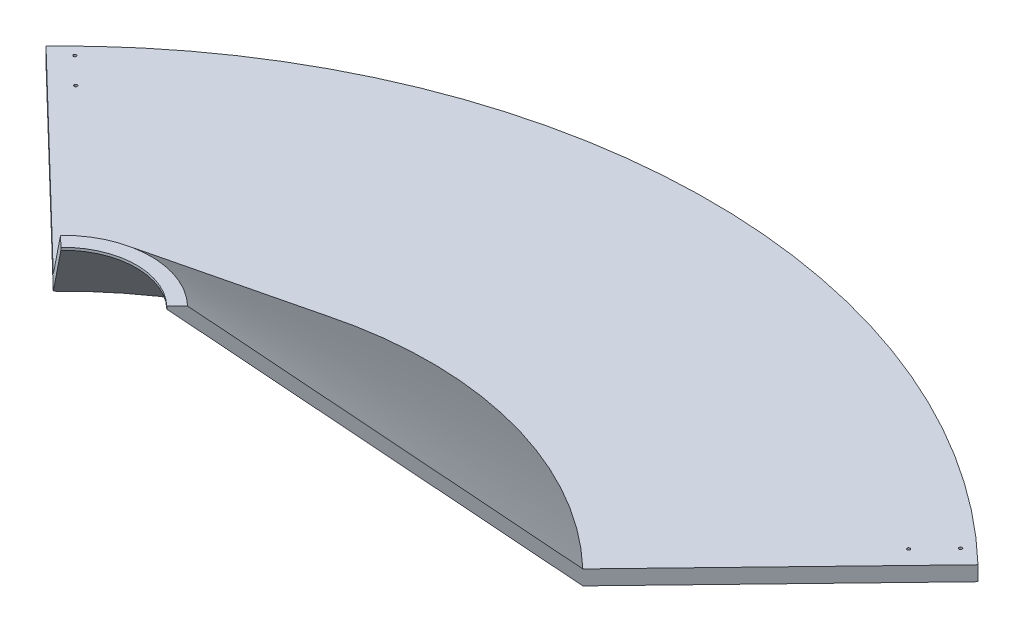
ISO-10303-21;
HEADER;
FILE_DESCRIPTION(('STEP AP214'),'2;1');
FILE_NAME('part.step','',(''),(''),'','','');
FILE_SCHEMA(('AUTOMOTIVE_DESIGN { 1 0 10303 214 1 1 1 1 }'));
ENDSEC;
DATA;
#1=APPLICATION_CONTEXT('core data for automotive mechanical design processes');
#2=APPLICATION_PROTOCOL_DEFINITION('international standard','automotive_design',2000,#1);
#3=PRODUCT_CONTEXT('',#1,'mechanical');
#4=PRODUCT('Part','Part','',(#3));
#5=PRODUCT_RELATED_PRODUCT_CATEGORY('part','',(#4));
#6=PRODUCT_DEFINITION_FORMATION('','',#4);
#7=PRODUCT_DEFINITION_CONTEXT('part definition',#1,'design');
#8=PRODUCT_DEFINITION('design','',#6,#7);
#9=PRODUCT_DEFINITION_SHAPE('','',#8);
#10=(LENGTH_UNIT() NAMED_UNIT(*) SI_UNIT(.MILLI.,.METRE.));
#11=(NAMED_UNIT(*) PLANE_ANGLE_UNIT() SI_UNIT($,.RADIAN.));
#12=(NAMED_UNIT(*) SI_UNIT($,.STERADIAN.) SOLID_ANGLE_UNIT());
#13=UNCERTAINTY_MEASURE_WITH_UNIT(LENGTH_MEASURE(1.E-05),#10,'distance_accuracy_value','');
#14=(GEOMETRIC_REPRESENTATION_CONTEXT(3) GLOBAL_UNCERTAINTY_ASSIGNED_CONTEXT((#13)) GLOBAL_UNIT_ASSIGNED_CONTEXT((#10,
#11,#12)) REPRESENTATION_CONTEXT('',''));
#15=CARTESIAN_POINT('',(0.,0.,0.));
#16=DIRECTION('',(0.,0.,1.));
#17=DIRECTION('',(1.,0.,0.));
#18=AXIS2_PLACEMENT_3D('',#15,#16,#17);
#19=CARTESIAN_POINT('',(457.650108708825,481.31508581917,0.));
#20=DIRECTION('',(0.,1.,0.));
#21=DIRECTION('',(-1.,0.,0.));
#22=AXIS2_PLACEMENT_3D('',#19,#20,#21);
#23=CYLINDRICAL_SURFACE('',#22,880.);
#24=CARTESIAN_POINT('',(457.650108708825,6.06253872324708,0.));
#25=DIRECTION('',(0.,1.,0.));
#26=DIRECTION('',(-1.,0.,0.));
#27=AXIS2_PLACEMENT_3D('',#24,#25,#26);
#28=CIRCLE('',#27,880.);
#29=CARTESIAN_POINT('',(1068.35624743679,6.06253872324719,-633.591360515577));
#30=VERTEX_POINT('',#29);
#31=CARTESIAN_POINT('',(-175.941251806752,6.06253872324697,-610.706138727965));
#32=VERTEX_POINT('',#31);
#33=EDGE_CURVE('E313',#30,#32,#28,.T.);
#34=ORIENTED_EDGE('',*,*,#33,.F.);
#35=DIRECTION('',(0.,1.,0.));
#36=VECTOR('',#35,1.);
#37=CARTESIAN_POINT('',(1068.35624743679,481.31508581917,-633.591360515577));
#38=LINE('',#37,#36);
#39=CARTESIAN_POINT('',(1068.35624743679,-13.9374612767531,-633.591360515577));
#40=VERTEX_POINT('',#39);
#41=EDGE_CURVE('E292',#30,#40,#38,.F.);
#42=ORIENTED_EDGE('',*,*,#41,.T.);
#43=CARTESIAN_POINT('',(457.650108708825,-13.9374612767529,0.));
#44=DIRECTION('',(0.,1.,0.));
#45=DIRECTION('',(-1.,0.,0.));
#46=AXIS2_PLACEMENT_3D('',#43,#44,#45);
#47=CIRCLE('',#46,880.);
#48=CARTESIAN_POINT('',(-175.941251806752,-13.937461276753,-610.706138727965));
#49=VERTEX_POINT('',#48);
#50=EDGE_CURVE('E295',#40,#49,#47,.T.);
#51=ORIENTED_EDGE('',*,*,#50,.T.);
#52=DIRECTION('',(0.,1.,0.));
#53=VECTOR('',#52,1.);
#54=CARTESIAN_POINT('',(-175.941251806752,481.315085819169,-610.706138727965));
#55=LINE('',#54,#53);
#56=EDGE_CURVE('E274',#49,#32,#55,.T.);
#57=ORIENTED_EDGE('',*,*,#56,.T.);
#58=EDGE_LOOP('',(#34,#42,#51,#57));
#59=FACE_BOUND('',#58,.T.);
#60=ADVANCED_FACE('F82',(#59),#23,.T.);
#61=CARTESIAN_POINT('',(-422.349891291175,6.0625387232469,0.));
#62=DIRECTION('',(0.,1.,0.));
#63=DIRECTION('',(-1.,0.,0.));
#64=AXIS2_PLACEMENT_3D('',#61,#62,#63);
#65=PLANE('',#64);
#66=CARTESIAN_POINT('',(1037.29315306664,6.06253872324715,-640.990486690408));
#67=DIRECTION('',(0.,1.,0.));
#68=DIRECTION('',(0.,0.,1.));
#69=AXIS2_PLACEMENT_3D('',#66,#67,#68);
#70=CIRCLE('',#69,2.09999999999999);
#71=CARTESIAN_POINT('',(1037.29315306664,6.06253872324715,-638.890486690408));
#72=VERTEX_POINT('',#71);
#73=EDGE_CURVE('E589',#72,#72,#70,.T.);
#74=ORIENTED_EDGE('',*,*,#73,.F.);
#75=EDGE_LOOP('',(#74));
#76=FACE_BOUND('',#75,.T.);
#77=CARTESIAN_POINT('',(1002.59394063891,6.06253872324714,-604.990977570205));
#78=DIRECTION('',(0.,1.,0.));
#79=DIRECTION('',(0.,0.,1.));
#80=AXIS2_PLACEMENT_3D('',#77,#78,#79);
#81=CIRCLE('',#80,2.09999999999999);
#82=CARTESIAN_POINT('',(1002.59394063891,6.06253872324714,-602.890977570205));
#83=VERTEX_POINT('',#82);
#84=EDGE_CURVE('E583',#83,#83,#81,.T.);
#85=ORIENTED_EDGE('',*,*,#84,.F.);
#86=EDGE_LOOP('',(#85));
#87=FACE_BOUND('',#86,.T.);
#88=CARTESIAN_POINT('',(-145.171244311085,6.06253872324695,-619.242504390037));
#89=DIRECTION('',(0.,1.,0.));
#90=DIRECTION('',(0.,0.,1.));
#91=AXIS2_PLACEMENT_3D('',#88,#89,#90);
#92=CIRCLE('',#91,2.09999999999999);
#93=CARTESIAN_POINT('',(-145.171244311085,6.06253872324695,-617.142504390037));
#94=VERTEX_POINT('',#93);
#95=EDGE_CURVE('E577',#94,#94,#92,.T.);
#96=ORIENTED_EDGE('',*,*,#95,.F.);
#97=EDGE_LOOP('',(#96));
#98=FACE_BOUND('',#97,.T.);
#99=CARTESIAN_POINT('',(-109.171735190882,6.06253872324695,-584.543291962312));
#100=DIRECTION('',(0.,1.,0.));
#101=DIRECTION('',(0.,0.,1.));
#102=AXIS2_PLACEMENT_3D('',#99,#100,#101);
#103=CIRCLE('',#102,2.09999999999999);
#104=CARTESIAN_POINT('',(-109.171735190882,6.06253872324695,-582.443291962312));
#105=VERTEX_POINT('',#104);
#106=EDGE_CURVE('E568',#105,#105,#103,.T.);
#107=ORIENTED_EDGE('',*,*,#106,.F.);
#108=EDGE_LOOP('',(#107));
#109=FACE_BOUND('',#108,.T.);
#110=CARTESIAN_POINT('',(457.650108708825,6.06253872324702,0.));
#111=DIRECTION('',(0.,1.,0.));
#112=DIRECTION('',(-1.,0.,0.));
#113=AXIS2_PLACEMENT_3D('',#110,#111,#112);
#114=CIRCLE('',#113,500.);
#115=CARTESIAN_POINT('',(804.642232986078,6.06253872324697,-359.995091202033));
#116=VERTEX_POINT('',#115);
#117=CARTESIAN_POINT('',(97.6550175067925,6.06253872324697,-346.992124277253));
#118=VERTEX_POINT('',#117);
#119=EDGE_CURVE('E310',#116,#118,#114,.T.);
#120=ORIENTED_EDGE('',*,*,#119,.F.);
#121=DIRECTION('',(0.693984248554505,0.,-0.719990182404065));
#122=VECTOR('',#121,1.);
#123=CARTESIAN_POINT('',(33.8296679360748,6.06253872324698,439.702424218029));
#124=LINE('',#123,#122);
#125=EDGE_CURVE('E289',#116,#30,#124,.T.);
#126=ORIENTED_EDGE('',*,*,#125,.T.);
#127=ORIENTED_EDGE('',*,*,#33,.T.);
#128=DIRECTION('',(0.719990182404065,0.,0.693984248554505));
#129=VECTOR('',#128,1.);
#130=CARTESIAN_POINT('',(1.47054948157493,6.06253872324697,-439.702424218029));
#131=LINE('',#130,#129);
#132=EDGE_CURVE('E271',#32,#118,#131,.T.);
#133=ORIENTED_EDGE('',*,*,#132,.T.);
#134=EDGE_LOOP('',(#120,#126,#127,#133));
#135=FACE_BOUND('',#134,.T.);
#136=ADVANCED_FACE('F327',(#76,#87,#98,#109,#135),#65,.T.);
#137=CARTESIAN_POINT('',(457.650108708825,320.562538723247,0.));
#138=DIRECTION('',(0.,-1.,0.));
#139=DIRECTION('',(1.,0.,0.));
#140=AXIS2_PLACEMENT_3D('',#137,#138,#139);
#141=CONICAL_SURFACE('',#140,120.,0.879432469977186);
#142=CARTESIAN_POINT('',(457.650108708825,320.562538723247,0.));
#143=DIRECTION('',(0.,1.,0.));
#144=DIRECTION('',(-1.,0.,0.));
#145=AXIS2_PLACEMENT_3D('',#142,#143,#144);
#146=CIRCLE('',#145,120.);
#147=CARTESIAN_POINT('',(540.928218535365,320.562538723247,-86.3988218884878));
#148=VERTEX_POINT('',#147);
#149=CARTESIAN_POINT('',(371.251286820337,320.562538723247,-83.2781098265407));
#150=VERTEX_POINT('',#149);
#151=EDGE_CURVE('E307',#148,#150,#146,.T.);
#152=ORIENTED_EDGE('',*,*,#151,.F.);
#153=DIRECTION('',(-0.534629609205775,0.637588459018517,0.554663986470073));
#154=VECTOR('',#153,1.);
#155=CARTESIAN_POINT('',(457.650108708825,419.878328196931,0.));
#156=LINE('',#155,#154);
#157=EDGE_CURVE('E286',#148,#116,#156,.F.);
#158=ORIENTED_EDGE('',*,*,#157,.T.);
#159=ORIENTED_EDGE('',*,*,#119,.T.);
#160=DIRECTION('',(-0.554663986470073,-0.637588459018517,-0.534629609205775));
#161=VECTOR('',#160,1.);
#162=CARTESIAN_POINT('',(457.650108708825,419.878328196931,0.));
#163=LINE('',#162,#161);
#164=EDGE_CURVE('E268',#118,#150,#163,.F.);
#165=ORIENTED_EDGE('',*,*,#164,.T.);
#166=EDGE_LOOP('',(#152,#158,#159,#165));
#167=FACE_BOUND('',#166,.T.);
#168=ADVANCED_FACE('F330',(#167),#141,.T.);
#169=CARTESIAN_POINT('',(337.650108708825,320.562538723247,0.));
#170=DIRECTION('',(0.,1.,0.));
#171=DIRECTION('',(-1.,0.,0.));
#172=AXIS2_PLACEMENT_3D('',#169,#170,#171);
#173=PLANE('',#172);
#174=CARTESIAN_POINT('',(457.650108708825,320.562538723247,0.));
#175=DIRECTION('',(0.,1.,0.));
#176=DIRECTION('',(-1.,0.,0.));
#177=AXIS2_PLACEMENT_3D('',#174,#175,#176);
#178=CIRCLE('',#177,100.);
#179=CARTESIAN_POINT('',(527.048533564275,320.562538723247,-71.9990182404065));
#180=VERTEX_POINT('',#179);
#181=CARTESIAN_POINT('',(385.651090468418,320.562538723247,-69.3984248554505));
#182=VERTEX_POINT('',#181);
#183=EDGE_CURVE('E304',#180,#182,#178,.T.);
#184=ORIENTED_EDGE('',*,*,#183,.F.);
#185=DIRECTION('',(0.693984248554505,0.,-0.719990182404065));
#186=VECTOR('',#185,1.);
#187=CARTESIAN_POINT('',(399.856412239813,320.562538723247,59.9594214842767));
#188=LINE('',#187,#186);
#189=EDGE_CURVE('E283',#180,#148,#188,.T.);
#190=ORIENTED_EDGE('',*,*,#189,.T.);
#191=ORIENTED_EDGE('',*,*,#151,.T.);
#192=DIRECTION('',(0.719990182404065,0.,0.693984248554505));
#193=VECTOR('',#192,1.);
#194=CARTESIAN_POINT('',(395.443805177836,320.562538723247,-59.9594214842768));
#195=LINE('',#194,#193);
#196=EDGE_CURVE('E265',#150,#182,#195,.T.);
#197=ORIENTED_EDGE('',*,*,#196,.T.);
#198=EDGE_LOOP('',(#184,#190,#191,#197));
#199=FACE_BOUND('',#198,.T.);
#200=ADVANCED_FACE('F333',(#199),#173,.T.);
#201=CARTESIAN_POINT('',(457.650108708825,481.31508581917,0.));
#202=DIRECTION('',(0.,1.,0.));
#203=DIRECTION('',(-1.,0.,0.));
#204=AXIS2_PLACEMENT_3D('',#201,#202,#203);
#205=CYLINDRICAL_SURFACE('',#204,100.);
#206=CARTESIAN_POINT('',(457.650108708825,317.115170302195,0.));
#207=DIRECTION('',(0.,1.,0.));
#208=DIRECTION('',(-1.,0.,0.));
#209=AXIS2_PLACEMENT_3D('',#206,#207,#208);
#210=CIRCLE('',#209,100.);
#211=CARTESIAN_POINT('',(527.048533564275,317.115170302195,-71.9990182404066));
#212=VERTEX_POINT('',#211);
#213=CARTESIAN_POINT('',(385.651090468418,317.115170302195,-69.3984248554506));
#214=VERTEX_POINT('',#213);
#215=EDGE_CURVE('E301',#212,#214,#210,.T.);
#216=ORIENTED_EDGE('',*,*,#215,.F.);
#217=DIRECTION('',(0.,1.,0.));
#218=VECTOR('',#217,1.);
#219=CARTESIAN_POINT('',(527.048533564275,481.31508581917,-71.9990182404065));
#220=LINE('',#219,#218);
#221=EDGE_CURVE('E280',#212,#180,#220,.T.);
#222=ORIENTED_EDGE('',*,*,#221,.T.);
#223=ORIENTED_EDGE('',*,*,#183,.T.);
#224=DIRECTION('',(0.,1.,0.));
#225=VECTOR('',#224,1.);
#226=CARTESIAN_POINT('',(385.651090468418,481.31508581917,-69.3984248554505));
#227=LINE('',#226,#225);
#228=EDGE_CURVE('E262',#182,#214,#227,.F.);
#229=ORIENTED_EDGE('',*,*,#228,.T.);
#230=EDGE_LOOP('',(#216,#222,#223,#229));
#231=FACE_BOUND('',#230,.T.);
#232=ADVANCED_FACE('F336',(#231),#205,.F.);
#233=CARTESIAN_POINT('',(457.650108708825,-13.9374612767529,0.));
#234=DIRECTION('',(0.,-1.,0.));
#235=DIRECTION('',(1.,0.,0.));
#236=AXIS2_PLACEMENT_3D('',#233,#234,#235);
#237=CONICAL_SURFACE('',#236,500.,0.879432469977186);
#238=CARTESIAN_POINT('',(457.650108708825,-13.9374612767529,0.));
#239=DIRECTION('',(0.,1.,0.));
#240=DIRECTION('',(-1.,0.,0.));
#241=AXIS2_PLACEMENT_3D('',#238,#239,#240);
#242=CIRCLE('',#241,500.);
#243=CARTESIAN_POINT('',(804.642232986078,-13.9374612767529,-359.995091202032));
#244=VERTEX_POINT('',#243);
#245=CARTESIAN_POINT('',(97.6550175067924,-13.9374612767533,-346.992124277253));
#246=VERTEX_POINT('',#245);
#247=EDGE_CURVE('E298',#244,#246,#242,.T.);
#248=ORIENTED_EDGE('',*,*,#247,.F.);
#249=DIRECTION('',(-0.534629609205775,0.637588459018517,0.554663986470073));
#250=VECTOR('',#249,1.);
#251=CARTESIAN_POINT('',(457.650108708825,399.878328196931,0.));
#252=LINE('',#251,#250);
#253=EDGE_CURVE('E277',#244,#212,#252,.T.);
#254=ORIENTED_EDGE('',*,*,#253,.T.);
#255=ORIENTED_EDGE('',*,*,#215,.T.);
#256=DIRECTION('',(-0.554663986470073,-0.637588459018517,-0.534629609205775));
#257=VECTOR('',#256,1.);
#258=CARTESIAN_POINT('',(457.650108708825,399.878328196931,0.));
#259=LINE('',#258,#257);
#260=EDGE_CURVE('E227',#214,#246,#259,.T.);
#261=ORIENTED_EDGE('',*,*,#260,.T.);
#262=EDGE_LOOP('',(#248,#254,#255,#261));
#263=FACE_BOUND('',#262,.T.);
#264=ADVANCED_FACE('F338',(#263),#237,.F.);
#265=CARTESIAN_POINT('',(-42.3498912911751,-13.937461276753,0.));
#266=DIRECTION('',(0.,-1.,0.));
#267=DIRECTION('',(1.,0.,0.));
#268=AXIS2_PLACEMENT_3D('',#265,#266,#267);
#269=PLANE('',#268);
#270=CARTESIAN_POINT('',(1037.29315306664,-13.9374612767528,-640.990486690408));
#271=DIRECTION('',(0.,-1.,0.));
#272=DIRECTION('',(1.,0.,0.));
#273=AXIS2_PLACEMENT_3D('',#270,#271,#272);
#274=CIRCLE('',#273,2.09999999999999);
#275=CARTESIAN_POINT('',(1039.39315306664,-13.9374612767528,-640.990486690408));
#276=VERTEX_POINT('',#275);
#277=EDGE_CURVE('E586',#276,#276,#274,.T.);
#278=ORIENTED_EDGE('',*,*,#277,.F.);
#279=EDGE_LOOP('',(#278));
#280=FACE_BOUND('',#279,.T.);
#281=CARTESIAN_POINT('',(1002.59394063891,-13.9374612767529,-604.990977570205));
#282=DIRECTION('',(0.,-1.,0.));
#283=DIRECTION('',(1.,0.,0.));
#284=AXIS2_PLACEMENT_3D('',#281,#282,#283);
#285=CIRCLE('',#284,2.09999999999999);
#286=CARTESIAN_POINT('',(1004.69394063891,-13.9374612767529,-604.990977570205));
#287=VERTEX_POINT('',#286);
#288=EDGE_CURVE('E580',#287,#287,#285,.T.);
#289=ORIENTED_EDGE('',*,*,#288,.F.);
#290=EDGE_LOOP('',(#289));
#291=FACE_BOUND('',#290,.T.);
#292=CARTESIAN_POINT('',(-145.171244311085,-13.937461276753,-619.242504390037));
#293=DIRECTION('',(0.,-1.,0.));
#294=DIRECTION('',(1.,0.,0.));
#295=AXIS2_PLACEMENT_3D('',#292,#293,#294);
#296=CIRCLE('',#295,2.09999999999999);
#297=CARTESIAN_POINT('',(-143.071244311085,-13.937461276753,-619.242504390037));
#298=VERTEX_POINT('',#297);
#299=EDGE_CURVE('E572',#298,#298,#296,.T.);
#300=ORIENTED_EDGE('',*,*,#299,.F.);
#301=EDGE_LOOP('',(#300));
#302=FACE_BOUND('',#301,.T.);
#303=CARTESIAN_POINT('',(-109.171735190882,-13.937461276753,-584.543291962312));
#304=DIRECTION('',(0.,-1.,0.));
#305=DIRECTION('',(1.,0.,0.));
#306=AXIS2_PLACEMENT_3D('',#303,#304,#305);
#307=CIRCLE('',#306,2.09999999999999);
#308=CARTESIAN_POINT('',(-107.071735190882,-13.937461276753,-584.543291962312));
#309=VERTEX_POINT('',#308);
#310=EDGE_CURVE('E247',#309,#309,#307,.T.);
#311=ORIENTED_EDGE('',*,*,#310,.F.);
#312=EDGE_LOOP('',(#311));
#313=FACE_BOUND('',#312,.T.);
#314=DIRECTION('',(1.,0.,0.));
#315=VECTOR('',#314,1.);
#316=CARTESIAN_POINT('',(486.018013734025,-13.9374612767529,-668.907950390559));
#317=LINE('',#316,#315);
#318=CARTESIAN_POINT('',(486.018013734025,-13.9374612767529,-668.907950390559));
#319=VERTEX_POINT('',#318);
#320=CARTESIAN_POINT('',(495.355954756697,-13.9374612767529,-668.907950390559));
#321=VERTEX_POINT('',#320);
#322=EDGE_CURVE('E96',#319,#321,#317,.T.);
#323=ORIENTED_EDGE('',*,*,#322,.F.);
#324=DIRECTION('',(0.,0.,-1.));
#325=VECTOR('',#324,1.);
#326=CARTESIAN_POINT('',(486.018013734025,-13.9374612767529,-632.910994036565));
#327=LINE('',#326,#325);
#328=CARTESIAN_POINT('',(486.018013734025,-13.9374612767529,-632.910994036565));
#329=VERTEX_POINT('',#328);
#330=EDGE_CURVE('E221',#329,#319,#327,.T.);
#331=ORIENTED_EDGE('',*,*,#330,.F.);
#332=DIRECTION('',(-1.,0.,0.));
#333=VECTOR('',#332,1.);
#334=CARTESIAN_POINT('',(496.018013734025,-13.9374612767529,-632.910994036565));
#335=LINE('',#334,#333);
#336=CARTESIAN_POINT('',(496.018013734025,-13.9374612767529,-632.910994036565));
#337=VERTEX_POINT('',#336);
#338=EDGE_CURVE('E218',#337,#329,#335,.T.);
#339=ORIENTED_EDGE('',*,*,#338,.F.);
#340=DIRECTION('',(0.0183889721761152,0.,0.999830908555195));
#341=VECTOR('',#340,1.);
#342=CARTESIAN_POINT('',(495.686956255868,-13.9374612767529,-650.910994036566));
#343=LINE('',#342,#341);
#344=EDGE_CURVE('E203',#321,#337,#343,.T.);
#345=ORIENTED_EDGE('',*,*,#344,.F.);
#346=EDGE_LOOP('',(#323,#331,#339,#345));
#347=FACE_BOUND('',#346,.T.);
#348=DIRECTION('',(-1.,0.,0.));
#349=VECTOR('',#348,1.);
#350=CARTESIAN_POINT('',(406.034922878505,-13.937461276753,-631.072096818954));
#351=LINE('',#350,#349);
#352=CARTESIAN_POINT('',(406.034922878505,-13.937461276753,-631.072096818954));
#353=VERTEX_POINT('',#352);
#354=CARTESIAN_POINT('',(396.034922878505,-13.937461276753,-631.072096818954));
#355=VERTEX_POINT('',#354);
#356=EDGE_CURVE('E104',#353,#355,#351,.T.);
#357=ORIENTED_EDGE('',*,*,#356,.F.);
#358=DIRECTION('',(0.0183889721761137,0.,0.999830908555195));
#359=VECTOR('',#358,1.);
#360=CARTESIAN_POINT('',(405.37280792219,-13.937461276753,-667.072096818954));
#361=LINE('',#360,#359);
#362=CARTESIAN_POINT('',(405.37280792219,-13.937461276753,-667.072096818954));
#363=VERTEX_POINT('',#362);
#364=EDGE_CURVE('E250',#363,#353,#361,.T.);
#365=ORIENTED_EDGE('',*,*,#364,.F.);
#366=DIRECTION('',(1.,0.,0.));
#367=VECTOR('',#366,1.);
#368=CARTESIAN_POINT('',(395.37280792219,-13.937461276753,-667.072096818954));
#369=LINE('',#368,#367);
#370=CARTESIAN_POINT('',(395.37280792219,-13.937461276753,-667.072096818954));
#371=VERTEX_POINT('',#370);
#372=EDGE_CURVE('E246',#371,#363,#369,.T.);
#373=ORIENTED_EDGE('',*,*,#372,.F.);
#374=DIRECTION('',(-0.0183889721761151,0.,-0.999830908555195));
#375=VECTOR('',#374,1.);
#376=CARTESIAN_POINT('',(395.703865400348,-13.937461276753,-649.072096818954));
#377=LINE('',#376,#375);
#378=EDGE_CURVE('E243',#355,#371,#377,.T.);
#379=ORIENTED_EDGE('',*,*,#378,.F.);
#380=EDGE_LOOP('',(#357,#365,#373,#379));
#381=FACE_BOUND('',#380,.T.);
#382=ORIENTED_EDGE('',*,*,#50,.F.);
#383=DIRECTION('',(-0.693984248554505,0.,0.719990182404065));
#384=VECTOR('',#383,1.);
#385=CARTESIAN_POINT('',(216.843040087944,-13.937461276753,249.830922851153));
#386=LINE('',#385,#384);
#387=EDGE_CURVE('E13',#40,#244,#386,.T.);
#388=ORIENTED_EDGE('',*,*,#387,.T.);
#389=ORIENTED_EDGE('',*,*,#247,.T.);
#390=DIRECTION('',(-0.719990182404065,0.,-0.693984248554505));
#391=VECTOR('',#390,1.);
#392=CARTESIAN_POINT('',(198.457177329706,-13.937461276753,-249.830922851153));
#393=LINE('',#392,#391);
#394=EDGE_CURVE('E89',#246,#49,#393,.T.);
#395=ORIENTED_EDGE('',*,*,#394,.T.);
#396=EDGE_LOOP('',(#382,#388,#389,#395));
#397=FACE_BOUND('',#396,.T.);
#398=ADVANCED_FACE('F318',(#280,#291,#302,#313,#347,#381,#397),#269,.T.);
#399=CARTESIAN_POINT('',(-719.073599651134,-13.9374612767534,-1134.22063030876));
#400=DIRECTION('',(-0.693984248554505,0.,0.719990182404065));
#401=DIRECTION('',(0.719990182404065,0.,0.693984248554505));
#402=AXIS2_PLACEMENT_3D('',#399,#400,#401);
#403=PLANE('',#402);
#404=ORIENTED_EDGE('',*,*,#394,.F.);
#405=ORIENTED_EDGE('',*,*,#260,.F.);
#406=ORIENTED_EDGE('',*,*,#228,.F.);
#407=ORIENTED_EDGE('',*,*,#196,.F.);
#408=ORIENTED_EDGE('',*,*,#164,.F.);
#409=ORIENTED_EDGE('',*,*,#132,.F.);
#410=ORIENTED_EDGE('',*,*,#56,.F.);
#411=EDGE_LOOP('',(#404,#405,#406,#407,#408,#409,#410));
#412=FACE_BOUND('',#411,.T.);
#413=ADVANCED_FACE('F339',(#412),#403,.T.);
#414=CARTESIAN_POINT('',(457.650108708825,-13.9374612767533,0.));
#415=DIRECTION('',(0.719990182404065,0.,0.693984248554505));
#416=DIRECTION('',(0.693984248554505,0.,-0.719990182404065));
#417=AXIS2_PLACEMENT_3D('',#414,#415,#416);
#418=PLANE('',#417);
#419=ORIENTED_EDGE('',*,*,#125,.F.);
#420=ORIENTED_EDGE('',*,*,#157,.F.);
#421=ORIENTED_EDGE('',*,*,#189,.F.);
#422=ORIENTED_EDGE('',*,*,#221,.F.);
#423=ORIENTED_EDGE('',*,*,#253,.F.);
#424=ORIENTED_EDGE('',*,*,#387,.F.);
#425=ORIENTED_EDGE('',*,*,#41,.F.);
#426=EDGE_LOOP('',(#419,#420,#421,#422,#423,#424,#425));
#427=FACE_BOUND('',#426,.T.);
#428=ADVANCED_FACE('F324',(#427),#418,.T.);
#429=CARTESIAN_POINT('',(406.034922878505,-3.93746127675295,-631.072096818954));
#430=DIRECTION('',(0.,0.,1.));
#431=DIRECTION('',(1.,0.,0.));
#432=AXIS2_PLACEMENT_3D('',#429,#430,#431);
#433=PLANE('',#432);
#434=ORIENTED_EDGE('',*,*,#356,.T.);
#435=DIRECTION('',(0.,-1.,0.));
#436=VECTOR('',#435,1.);
#437=CARTESIAN_POINT('',(396.034922878505,-3.93746127675296,-631.072096818954));
#438=LINE('',#437,#436);
#439=CARTESIAN_POINT('',(396.034922878505,-3.93746127675296,-631.072096818954));
#440=VERTEX_POINT('',#439);
#441=EDGE_CURVE('E219',#440,#355,#438,.T.);
#442=ORIENTED_EDGE('',*,*,#441,.F.);
#443=DIRECTION('',(-1.,0.,0.));
#444=VECTOR('',#443,1.);
#445=CARTESIAN_POINT('',(406.034922878505,-3.93746127675295,-631.072096818954));
#446=LINE('',#445,#444);
#447=CARTESIAN_POINT('',(406.034922878505,-3.93746127675295,-631.072096818954));
#448=VERTEX_POINT('',#447);
#449=EDGE_CURVE('E239',#448,#440,#446,.T.);
#450=ORIENTED_EDGE('',*,*,#449,.F.);
#451=DIRECTION('',(0.,-1.,0.));
#452=VECTOR('',#451,1.);
#453=CARTESIAN_POINT('',(406.034922878505,-3.93746127675295,-631.072096818954));
#454=LINE('',#453,#452);
#455=EDGE_CURVE('E255',#448,#353,#454,.T.);
#456=ORIENTED_EDGE('',*,*,#455,.T.);
#457=EDGE_LOOP('',(#434,#442,#450,#456));
#458=FACE_BOUND('',#457,.T.);
#459=ADVANCED_FACE('F346',(#458),#433,.F.);
#460=CARTESIAN_POINT('',(405.37280792219,-3.93746127675295,-667.072096818954));
#461=DIRECTION('',(0.999830908555195,0.,-0.0183889721761137));
#462=DIRECTION('',(-0.0183889721761137,0.,-0.999830908555195));
#463=AXIS2_PLACEMENT_3D('',#460,#461,#462);
#464=PLANE('',#463);
#465=ORIENTED_EDGE('',*,*,#364,.T.);
#466=ORIENTED_EDGE('',*,*,#455,.F.);
#467=DIRECTION('',(0.0183889721761137,0.,0.999830908555195));
#468=VECTOR('',#467,1.);
#469=CARTESIAN_POINT('',(405.37280792219,-3.93746127675295,-667.072096818954));
#470=LINE('',#469,#468);
#471=CARTESIAN_POINT('',(405.37280792219,-3.93746127675295,-667.072096818954));
#472=VERTEX_POINT('',#471);
#473=EDGE_CURVE('E236',#472,#448,#470,.T.);
#474=ORIENTED_EDGE('',*,*,#473,.F.);
#475=DIRECTION('',(0.,-1.,0.));
#476=VECTOR('',#475,1.);
#477=CARTESIAN_POINT('',(405.37280792219,-3.93746127675295,-667.072096818954));
#478=LINE('',#477,#476);
#479=EDGE_CURVE('E257',#472,#363,#478,.T.);
#480=ORIENTED_EDGE('',*,*,#479,.T.);
#481=EDGE_LOOP('',(#465,#466,#474,#480));
#482=FACE_BOUND('',#481,.T.);
#483=ADVANCED_FACE('F434',(#482),#464,.F.);
#484=CARTESIAN_POINT('',(395.37280792219,-3.93746127675296,-667.072096818954));
#485=DIRECTION('',(0.,0.,-1.));
#486=DIRECTION('',(-1.,0.,0.));
#487=AXIS2_PLACEMENT_3D('',#484,#485,#486);
#488=PLANE('',#487);
#489=ORIENTED_EDGE('',*,*,#372,.T.);
#490=ORIENTED_EDGE('',*,*,#479,.F.);
#491=DIRECTION('',(1.,0.,0.));
#492=VECTOR('',#491,1.);
#493=CARTESIAN_POINT('',(395.37280792219,-3.93746127675296,-667.072096818954));
#494=LINE('',#493,#492);
#495=CARTESIAN_POINT('',(395.37280792219,-3.93746127675296,-667.072096818954));
#496=VERTEX_POINT('',#495);
#497=EDGE_CURVE('E233',#496,#472,#494,.T.);
#498=ORIENTED_EDGE('',*,*,#497,.F.);
#499=DIRECTION('',(0.,-1.,0.));
#500=VECTOR('',#499,1.);
#501=CARTESIAN_POINT('',(395.37280792219,-3.93746127675296,-667.072096818954));
#502=LINE('',#501,#500);
#503=EDGE_CURVE('E242',#496,#371,#502,.T.);
#504=ORIENTED_EDGE('',*,*,#503,.T.);
#505=EDGE_LOOP('',(#489,#490,#498,#504));
#506=FACE_BOUND('',#505,.T.);
#507=ADVANCED_FACE('F437',(#506),#488,.F.);
#508=CARTESIAN_POINT('',(395.703865400348,-3.93746127675296,-649.072096818954));
#509=DIRECTION('',(-0.999830908555195,0.,0.0183889721761151));
#510=DIRECTION('',(0.0183889721761151,0.,0.999830908555195));
#511=AXIS2_PLACEMENT_3D('',#508,#509,#510);
#512=PLANE('',#511);
#513=ORIENTED_EDGE('',*,*,#378,.T.);
#514=ORIENTED_EDGE('',*,*,#503,.F.);
#515=DIRECTION('',(-0.0183889721761122,0.,-0.999830908555195));
#516=VECTOR('',#515,1.);
#517=CARTESIAN_POINT('',(396.034922878505,-3.93746127675296,-631.072096818954));
#518=LINE('',#517,#516);
#519=EDGE_CURVE('E231',#440,#496,#518,.T.);
#520=ORIENTED_EDGE('',*,*,#519,.F.);
#521=ORIENTED_EDGE('',*,*,#441,.T.);
#522=EDGE_LOOP('',(#513,#514,#520,#521));
#523=FACE_BOUND('',#522,.T.);
#524=ADVANCED_FACE('F430',(#523),#512,.F.);
#525=CARTESIAN_POINT('',(0.,-3.93746127675303,0.));
#526=DIRECTION('',(0.,-1.,0.));
#527=DIRECTION('',(1.,0.,0.));
#528=AXIS2_PLACEMENT_3D('',#525,#526,#527);
#529=PLANE('',#528);
#530=ORIENTED_EDGE('',*,*,#519,.T.);
#531=ORIENTED_EDGE('',*,*,#497,.T.);
#532=ORIENTED_EDGE('',*,*,#473,.T.);
#533=ORIENTED_EDGE('',*,*,#449,.T.);
#534=EDGE_LOOP('',(#530,#531,#532,#533));
#535=FACE_BOUND('',#534,.T.);
#536=ADVANCED_FACE('F420',(#535),#529,.T.);
#537=CARTESIAN_POINT('',(486.018013734025,-3.93746127675294,-668.907950390559));
#538=DIRECTION('',(0.,0.,-1.));
#539=DIRECTION('',(-1.,0.,0.));
#540=AXIS2_PLACEMENT_3D('',#537,#538,#539);
#541=PLANE('',#540);
#542=ORIENTED_EDGE('',*,*,#322,.T.);
#543=DIRECTION('',(0.,-1.,0.));
#544=VECTOR('',#543,1.);
#545=CARTESIAN_POINT('',(495.355954756698,-3.93746127675294,-668.907950390559));
#546=LINE('',#545,#544);
#547=CARTESIAN_POINT('',(495.355954756698,-3.93746127675294,-668.907950390559));
#548=VERTEX_POINT('',#547);
#549=EDGE_CURVE('E225',#548,#321,#546,.T.);
#550=ORIENTED_EDGE('',*,*,#549,.F.);
#551=DIRECTION('',(1.,0.,0.));
#552=VECTOR('',#551,1.);
#553=CARTESIAN_POINT('',(486.018013734025,-3.93746127675294,-668.907950390559));
#554=LINE('',#553,#552);
#555=CARTESIAN_POINT('',(486.018013734025,-3.93746127675294,-668.907950390559));
#556=VERTEX_POINT('',#555);
#557=EDGE_CURVE('E196',#556,#548,#554,.T.);
#558=ORIENTED_EDGE('',*,*,#557,.F.);
#559=DIRECTION('',(0.,-1.,0.));
#560=VECTOR('',#559,1.);
#561=CARTESIAN_POINT('',(486.018013734025,-3.93746127675294,-668.907950390559));
#562=LINE('',#561,#560);
#563=EDGE_CURVE('E228',#556,#319,#562,.T.);
#564=ORIENTED_EDGE('',*,*,#563,.T.);
#565=EDGE_LOOP('',(#542,#550,#558,#564));
#566=FACE_BOUND('',#565,.T.);
#567=ADVANCED_FACE('F416',(#566),#541,.F.);
#568=CARTESIAN_POINT('',(486.018013734025,-3.93746127675294,-632.910994036565));
#569=DIRECTION('',(-1.,0.,0.));
#570=DIRECTION('',(0.,-1.,0.));
#571=AXIS2_PLACEMENT_3D('',#568,#569,#570);
#572=PLANE('',#571);
#573=ORIENTED_EDGE('',*,*,#330,.T.);
#574=ORIENTED_EDGE('',*,*,#563,.F.);
#575=DIRECTION('',(0.,0.,-1.));
#576=VECTOR('',#575,1.);
#577=CARTESIAN_POINT('',(486.018013734025,-3.93746127675294,-632.910994036565));
#578=LINE('',#577,#576);
#579=CARTESIAN_POINT('',(486.018013734025,-3.93746127675294,-632.910994036565));
#580=VERTEX_POINT('',#579);
#581=EDGE_CURVE('E211',#580,#556,#578,.T.);
#582=ORIENTED_EDGE('',*,*,#581,.F.);
#583=DIRECTION('',(0.,-1.,0.));
#584=VECTOR('',#583,1.);
#585=CARTESIAN_POINT('',(486.018013734025,-3.93746127675294,-632.910994036565));
#586=LINE('',#585,#584);
#587=EDGE_CURVE('E207',#580,#329,#586,.T.);
#588=ORIENTED_EDGE('',*,*,#587,.T.);
#589=EDGE_LOOP('',(#573,#574,#582,#588));
#590=FACE_BOUND('',#589,.T.);
#591=ADVANCED_FACE('F419',(#590),#572,.F.);
#592=CARTESIAN_POINT('',(496.018013734025,-3.93746127675294,-632.910994036565));
#593=DIRECTION('',(0.,0.,1.));
#594=DIRECTION('',(1.,0.,0.));
#595=AXIS2_PLACEMENT_3D('',#592,#593,#594);
#596=PLANE('',#595);
#597=ORIENTED_EDGE('',*,*,#338,.T.);
#598=ORIENTED_EDGE('',*,*,#587,.F.);
#599=DIRECTION('',(-1.,0.,0.));
#600=VECTOR('',#599,1.);
#601=CARTESIAN_POINT('',(496.018013734025,-3.93746127675294,-632.910994036565));
#602=LINE('',#601,#600);
#603=CARTESIAN_POINT('',(496.018013734025,-3.93746127675294,-632.910994036565));
#604=VERTEX_POINT('',#603);
#605=EDGE_CURVE('E194',#604,#580,#602,.T.);
#606=ORIENTED_EDGE('',*,*,#605,.F.);
#607=DIRECTION('',(0.,-1.,0.));
#608=VECTOR('',#607,1.);
#609=CARTESIAN_POINT('',(496.018013734025,-3.93746127675294,-632.910994036565));
#610=LINE('',#609,#608);
#611=EDGE_CURVE('E200',#604,#337,#610,.T.);
#612=ORIENTED_EDGE('',*,*,#611,.T.);
#613=EDGE_LOOP('',(#597,#598,#606,#612));
#614=FACE_BOUND('',#613,.T.);
#615=ADVANCED_FACE('F209',(#614),#596,.F.);
#616=CARTESIAN_POINT('',(495.686956255868,-3.93746127675294,-650.910994036566));
#617=DIRECTION('',(0.999830908555195,0.,-0.0183889721761152));
#618=DIRECTION('',(-0.0183889721761152,0.,-0.999830908555195));
#619=AXIS2_PLACEMENT_3D('',#616,#617,#618);
#620=PLANE('',#619);
#621=ORIENTED_EDGE('',*,*,#344,.T.);
#622=ORIENTED_EDGE('',*,*,#611,.F.);
#623=DIRECTION('',(0.0183889721760947,0.,0.999830908555195));
#624=VECTOR('',#623,1.);
#625=CARTESIAN_POINT('',(495.355954756698,-3.93746127675294,-668.907950390559));
#626=LINE('',#625,#624);
#627=EDGE_CURVE('E189',#548,#604,#626,.T.);
#628=ORIENTED_EDGE('',*,*,#627,.F.);
#629=ORIENTED_EDGE('',*,*,#549,.T.);
#630=EDGE_LOOP('',(#621,#622,#628,#629));
#631=FACE_BOUND('',#630,.T.);
#632=ADVANCED_FACE('F201',(#631),#620,.F.);
#633=CARTESIAN_POINT('',(0.,-3.93746127675303,0.));
#634=DIRECTION('',(0.,-1.,0.));
#635=DIRECTION('',(1.,0.,0.));
#636=AXIS2_PLACEMENT_3D('',#633,#634,#635);
#637=PLANE('',#636);
#638=ORIENTED_EDGE('',*,*,#627,.T.);
#639=ORIENTED_EDGE('',*,*,#605,.T.);
#640=ORIENTED_EDGE('',*,*,#581,.T.);
#641=ORIENTED_EDGE('',*,*,#557,.T.);
#642=EDGE_LOOP('',(#638,#639,#640,#641));
#643=FACE_BOUND('',#642,.T.);
#644=ADVANCED_FACE('F191',(#643),#637,.T.);
#645=CARTESIAN_POINT('',(-109.171735190882,6.06253872324695,-584.543291962312));
#646=DIRECTION('',(0.,1.,0.));
#647=DIRECTION('',(0.,0.,1.));
#648=AXIS2_PLACEMENT_3D('',#645,#646,#647);
#649=CYLINDRICAL_SURFACE('',#648,2.09999999999999);
#650=ORIENTED_EDGE('',*,*,#106,.T.);
#651=EDGE_LOOP('',(#650));
#652=FACE_BOUND('',#651,.T.);
#653=ORIENTED_EDGE('',*,*,#310,.T.);
#654=EDGE_LOOP('',(#653));
#655=FACE_BOUND('',#654,.T.);
#656=ADVANCED_FACE('F409',(#652,#655),#649,.F.);
#657=CARTESIAN_POINT('',(-145.171244311085,6.06253872324694,-619.242504390037));
#658=DIRECTION('',(0.,1.,0.));
#659=DIRECTION('',(0.,0.,1.));
#660=AXIS2_PLACEMENT_3D('',#657,#658,#659);
#661=CYLINDRICAL_SURFACE('',#660,2.09999999999999);
#662=ORIENTED_EDGE('',*,*,#95,.T.);
#663=EDGE_LOOP('',(#662));
#664=FACE_BOUND('',#663,.T.);
#665=ORIENTED_EDGE('',*,*,#299,.T.);
#666=EDGE_LOOP('',(#665));
#667=FACE_BOUND('',#666,.T.);
#668=ADVANCED_FACE('F389',(#664,#667),#661,.F.);
#669=CARTESIAN_POINT('',(1002.59394063891,6.06253872324714,-604.990977570205));
#670=DIRECTION('',(0.,1.,0.));
#671=DIRECTION('',(0.,0.,1.));
#672=AXIS2_PLACEMENT_3D('',#669,#670,#671);
#673=CYLINDRICAL_SURFACE('',#672,2.09999999999999);
#674=ORIENTED_EDGE('',*,*,#84,.T.);
#675=EDGE_LOOP('',(#674));
#676=FACE_BOUND('',#675,.T.);
#677=ORIENTED_EDGE('',*,*,#288,.T.);
#678=EDGE_LOOP('',(#677));
#679=FACE_BOUND('',#678,.T.);
#680=ADVANCED_FACE('F383',(#676,#679),#673,.F.);
#681=CARTESIAN_POINT('',(1037.29315306664,6.06253872324715,-640.990486690408));
#682=DIRECTION('',(0.,1.,0.));
#683=DIRECTION('',(0.,0.,1.));
#684=AXIS2_PLACEMENT_3D('',#681,#682,#683);
#685=CYLINDRICAL_SURFACE('',#684,2.09999999999999);
#686=ORIENTED_EDGE('',*,*,#73,.T.);
#687=EDGE_LOOP('',(#686));
#688=FACE_BOUND('',#687,.T.);
#689=ORIENTED_EDGE('',*,*,#277,.T.);
#690=EDGE_LOOP('',(#689));
#691=FACE_BOUND('',#690,.T.);
#692=ADVANCED_FACE('F388',(#688,#691),#685,.F.);
#693=CLOSED_SHELL('',(#60,#136,#168,#200,#232,#264,#398,#413,#428,#459,#483,#507,#524,#536,#567,
#591,#615,#632,#644,#656,#668,#680,#692));
#694=MANIFOLD_SOLID_BREP('B2',#693);
#695=ADVANCED_BREP_SHAPE_REPRESENTATION('',(#18,#694),#14);
#696=SHAPE_DEFINITION_REPRESENTATION(#9,#695);
ENDSEC;
END-ISO-10303-21;
